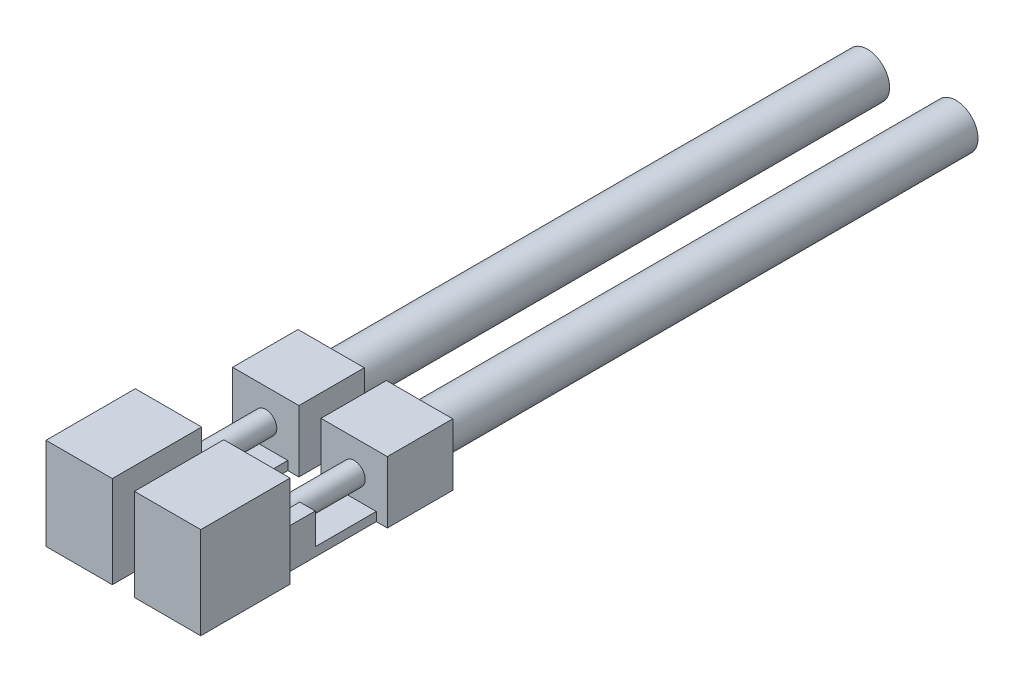
ISO-10303-21;
HEADER;
FILE_DESCRIPTION(('STEP AP214'),'2;1');
FILE_NAME('part.step','',(''),(''),'','','');
FILE_SCHEMA(('AUTOMOTIVE_DESIGN { 1 0 10303 214 1 1 1 1 }'));
ENDSEC;
DATA;
#1=APPLICATION_CONTEXT('core data for automotive mechanical design processes');
#2=APPLICATION_PROTOCOL_DEFINITION('international standard','automotive_design',2000,#1);
#3=PRODUCT_CONTEXT('',#1,'mechanical');
#4=PRODUCT('Part','Part','',(#3));
#5=PRODUCT_RELATED_PRODUCT_CATEGORY('part','',(#4));
#6=PRODUCT_DEFINITION_FORMATION('','',#4);
#7=PRODUCT_DEFINITION_CONTEXT('part definition',#1,'design');
#8=PRODUCT_DEFINITION('design','',#6,#7);
#9=PRODUCT_DEFINITION_SHAPE('','',#8);
#10=(LENGTH_UNIT() NAMED_UNIT(*) SI_UNIT(.MILLI.,.METRE.));
#11=(NAMED_UNIT(*) PLANE_ANGLE_UNIT() SI_UNIT($,.RADIAN.));
#12=(NAMED_UNIT(*) SI_UNIT($,.STERADIAN.) SOLID_ANGLE_UNIT());
#13=UNCERTAINTY_MEASURE_WITH_UNIT(LENGTH_MEASURE(1.E-05),#10,'distance_accuracy_value','');
#14=(GEOMETRIC_REPRESENTATION_CONTEXT(3) GLOBAL_UNCERTAINTY_ASSIGNED_CONTEXT((#13)) GLOBAL_UNIT_ASSIGNED_CONTEXT((#10,
#11,#12)) REPRESENTATION_CONTEXT('',''));
#15=CARTESIAN_POINT('',(0.,0.,0.));
#16=DIRECTION('',(0.,0.,1.));
#17=DIRECTION('',(1.,0.,0.));
#18=AXIS2_PLACEMENT_3D('',#15,#16,#17);
#19=CARTESIAN_POINT('',(-1.75,2.78,0.39));
#20=DIRECTION('',(0.,-1.,0.));
#21=DIRECTION('',(0.,0.,-1.));
#22=AXIS2_PLACEMENT_3D('',#19,#20,#21);
#23=PLANE('',#22);
#24=DIRECTION('',(0.,0.,-1.));
#25=VECTOR('',#24,1.);
#26=CARTESIAN_POINT('',(-1.4,2.78,0.39));
#27=LINE('',#26,#25);
#28=CARTESIAN_POINT('',(-1.4,2.78,-0.44));
#29=VERTEX_POINT('',#28);
#30=CARTESIAN_POINT('',(-1.4,2.78,0.385));
#31=VERTEX_POINT('',#30);
#32=EDGE_CURVE('E284',#29,#31,#27,.F.);
#33=ORIENTED_EDGE('',*,*,#32,.F.);
#34=DIRECTION('',(-1.,0.,0.));
#35=VECTOR('',#34,1.);
#36=CARTESIAN_POINT('',(-1.75,2.78,-0.44));
#37=LINE('',#36,#35);
#38=CARTESIAN_POINT('',(-1.75,2.78,-0.44));
#39=VERTEX_POINT('',#38);
#40=EDGE_CURVE('E266',#29,#39,#37,.T.);
#41=ORIENTED_EDGE('',*,*,#40,.T.);
#42=DIRECTION('',(0.,0.,-1.));
#43=VECTOR('',#42,1.);
#44=CARTESIAN_POINT('',(-1.75,2.78,0.39));
#45=LINE('',#44,#43);
#46=CARTESIAN_POINT('',(-1.75,2.78,0.38));
#47=VERTEX_POINT('',#46);
#48=EDGE_CURVE('E240',#47,#39,#45,.T.);
#49=ORIENTED_EDGE('',*,*,#48,.F.);
#50=DIRECTION('',(-1.,0.,0.));
#51=VECTOR('',#50,1.);
#52=CARTESIAN_POINT('',(0.,2.78,0.38));
#53=LINE('',#52,#51);
#54=EDGE_CURVE('E238',#31,#47,#53,.T.);
#55=ORIENTED_EDGE('',*,*,#54,.F.);
#56=EDGE_LOOP('',(#33,#41,#49,#55));
#57=FACE_BOUND('',#56,.T.);
#58=ADVANCED_FACE('F47',(#57),#23,.F.);
#59=DIRECTION('',(0.,0.,-1.));
#60=VECTOR('',#59,1.);
#61=CARTESIAN_POINT('',(-1.1,2.78,0.39));
#62=LINE('',#61,#60);
#63=CARTESIAN_POINT('',(-1.1,2.78,0.385));
#64=VERTEX_POINT('',#63);
#65=CARTESIAN_POINT('',(-1.1,2.78,-0.44));
#66=VERTEX_POINT('',#65);
#67=EDGE_CURVE('E66',#64,#66,#62,.T.);
#68=ORIENTED_EDGE('',*,*,#67,.F.);
#69=CARTESIAN_POINT('',(-0.75,2.78,0.38));
#70=VERTEX_POINT('',#69);
#71=EDGE_CURVE('E252',#70,#64,#53,.T.);
#72=ORIENTED_EDGE('',*,*,#71,.F.);
#73=DIRECTION('',(0.,0.,-1.));
#74=VECTOR('',#73,1.);
#75=CARTESIAN_POINT('',(-0.75,2.78,0.39));
#76=LINE('',#75,#74);
#77=CARTESIAN_POINT('',(-0.75,2.78,-0.44));
#78=VERTEX_POINT('',#77);
#79=EDGE_CURVE('E243',#70,#78,#76,.T.);
#80=ORIENTED_EDGE('',*,*,#79,.T.);
#81=EDGE_CURVE('E237',#78,#66,#37,.T.);
#82=ORIENTED_EDGE('',*,*,#81,.T.);
#83=EDGE_LOOP('',(#68,#72,#80,#82));
#84=FACE_BOUND('',#83,.T.);
#85=ADVANCED_FACE('F285',(#84),#23,.F.);
#86=CARTESIAN_POINT('',(0.,0.,-1.82));
#87=DIRECTION('',(0.,0.,-1.));
#88=DIRECTION('',(-1.,0.,0.));
#89=AXIS2_PLACEMENT_3D('',#86,#87,#88);
#90=PLANE('',#89);
#91=CARTESIAN_POINT('',(-1.25,2.58,-1.82));
#92=DIRECTION('',(0.,0.,-1.));
#93=DIRECTION('',(-1.,0.,0.));
#94=AXIS2_PLACEMENT_3D('',#91,#92,#93);
#95=CIRCLE('',#94,0.25);
#96=CARTESIAN_POINT('',(-1.5,2.58,-1.82));
#97=VERTEX_POINT('',#96);
#98=EDGE_CURVE('E12',#97,#97,#95,.F.);
#99=ORIENTED_EDGE('',*,*,#98,.F.);
#100=EDGE_LOOP('',(#99));
#101=FACE_BOUND('',#100,.T.);
#102=DIRECTION('',(0.,-1.,0.));
#103=VECTOR('',#102,1.);
#104=CARTESIAN_POINT('',(-1.75,0.,-1.82));
#105=LINE('',#104,#103);
#106=CARTESIAN_POINT('',(-1.75,2.08,-1.82));
#107=VERTEX_POINT('',#106);
#108=CARTESIAN_POINT('',(-1.75,1.88,-1.82));
#109=VERTEX_POINT('',#108);
#110=EDGE_CURVE('E210',#107,#109,#105,.T.);
#111=ORIENTED_EDGE('',*,*,#110,.F.);
#112=DIRECTION('',(-1.,0.,0.));
#113=VECTOR('',#112,1.);
#114=CARTESIAN_POINT('',(0.,2.08,-1.82));
#115=LINE('',#114,#113);
#116=CARTESIAN_POINT('',(-0.75,2.08,-1.82));
#117=VERTEX_POINT('',#116);
#118=EDGE_CURVE('E80',#117,#107,#115,.T.);
#119=ORIENTED_EDGE('',*,*,#118,.F.);
#120=DIRECTION('',(0.,1.,0.));
#121=VECTOR('',#120,1.);
#122=CARTESIAN_POINT('',(-0.75,0.,-1.82));
#123=LINE('',#122,#121);
#124=CARTESIAN_POINT('',(-0.75,1.88,-1.82));
#125=VERTEX_POINT('',#124);
#126=EDGE_CURVE('E207',#125,#117,#123,.T.);
#127=ORIENTED_EDGE('',*,*,#126,.F.);
#128=DIRECTION('',(-1.,0.,0.));
#129=VECTOR('',#128,1.);
#130=CARTESIAN_POINT('',(0.,1.88,-1.82));
#131=LINE('',#130,#129);
#132=CARTESIAN_POINT('',(-0.5,1.88,-1.82));
#133=VERTEX_POINT('',#132);
#134=EDGE_CURVE('E180',#125,#133,#131,.F.);
#135=ORIENTED_EDGE('',*,*,#134,.T.);
#136=DIRECTION('',(0.,1.,0.));
#137=VECTOR('',#136,1.);
#138=CARTESIAN_POINT('',(-0.5,1.88,-1.82));
#139=LINE('',#138,#137);
#140=CARTESIAN_POINT('',(-0.5,3.28,-1.82));
#141=VERTEX_POINT('',#140);
#142=EDGE_CURVE('E168',#133,#141,#139,.T.);
#143=ORIENTED_EDGE('',*,*,#142,.T.);
#144=DIRECTION('',(-1.,0.,0.));
#145=VECTOR('',#144,1.);
#146=CARTESIAN_POINT('',(-2.,3.28,-1.82));
#147=LINE('',#146,#145);
#148=CARTESIAN_POINT('',(-2.,3.28,-1.82));
#149=VERTEX_POINT('',#148);
#150=EDGE_CURVE('E172',#141,#149,#147,.T.);
#151=ORIENTED_EDGE('',*,*,#150,.T.);
#152=DIRECTION('',(0.,-1.,0.));
#153=VECTOR('',#152,1.);
#154=CARTESIAN_POINT('',(-2.,1.88,-1.82));
#155=LINE('',#154,#153);
#156=CARTESIAN_POINT('',(-2.,1.88,-1.82));
#157=VERTEX_POINT('',#156);
#158=EDGE_CURVE('E199',#149,#157,#155,.T.);
#159=ORIENTED_EDGE('',*,*,#158,.T.);
#160=DIRECTION('',(-1.,0.,0.));
#161=VECTOR('',#160,1.);
#162=CARTESIAN_POINT('',(0.,1.88,-1.82));
#163=LINE('',#162,#161);
#164=EDGE_CURVE('E201',#157,#109,#163,.F.);
#165=ORIENTED_EDGE('',*,*,#164,.T.);
#166=EDGE_LOOP('',(#111,#119,#127,#135,#143,#151,#159,#165));
#167=FACE_BOUND('',#166,.T.);
#168=ADVANCED_FACE('F51',(#101,#167),#90,.F.);
#169=CARTESIAN_POINT('',(-2.,1.88,-1.82));
#170=DIRECTION('',(1.,0.,0.));
#171=DIRECTION('',(0.,0.,-1.));
#172=AXIS2_PLACEMENT_3D('',#169,#170,#171);
#173=PLANE('',#172);
#174=DIRECTION('',(0.,-1.,0.));
#175=VECTOR('',#174,1.);
#176=CARTESIAN_POINT('',(-2.,1.88,-3.3));
#177=LINE('',#176,#175);
#178=CARTESIAN_POINT('',(-2.,3.28,-3.3));
#179=VERTEX_POINT('',#178);
#180=CARTESIAN_POINT('',(-2.,1.88,-3.3));
#181=VERTEX_POINT('',#180);
#182=EDGE_CURVE('E58',#179,#181,#177,.T.);
#183=ORIENTED_EDGE('',*,*,#182,.T.);
#184=DIRECTION('',(0.,0.,-1.));
#185=VECTOR('',#184,1.);
#186=CARTESIAN_POINT('',(-2.,1.88,-1.82));
#187=LINE('',#186,#185);
#188=EDGE_CURVE('E204',#157,#181,#187,.T.);
#189=ORIENTED_EDGE('',*,*,#188,.F.);
#190=ORIENTED_EDGE('',*,*,#158,.F.);
#191=DIRECTION('',(0.,0.,-1.));
#192=VECTOR('',#191,1.);
#193=CARTESIAN_POINT('',(-2.,3.28,-1.82));
#194=LINE('',#193,#192);
#195=EDGE_CURVE('E187',#149,#179,#194,.T.);
#196=ORIENTED_EDGE('',*,*,#195,.T.);
#197=EDGE_LOOP('',(#183,#189,#190,#196));
#198=FACE_BOUND('',#197,.T.);
#199=ADVANCED_FACE('F351',(#198),#173,.F.);
#200=CARTESIAN_POINT('',(-2.,1.88,-1.82));
#201=DIRECTION('',(0.,1.,0.));
#202=DIRECTION('',(0.,0.,1.));
#203=AXIS2_PLACEMENT_3D('',#200,#201,#202);
#204=PLANE('',#203);
#205=DIRECTION('',(1.,0.,0.));
#206=VECTOR('',#205,1.);
#207=CARTESIAN_POINT('',(-2.,1.88,-3.3));
#208=LINE('',#207,#206);
#209=CARTESIAN_POINT('',(-0.5,1.88,-3.3));
#210=VERTEX_POINT('',#209);
#211=EDGE_CURVE('E371',#181,#210,#208,.T.);
#212=ORIENTED_EDGE('',*,*,#211,.T.);
#213=DIRECTION('',(0.,0.,-1.));
#214=VECTOR('',#213,1.);
#215=CARTESIAN_POINT('',(-0.5,1.88,-1.82));
#216=LINE('',#215,#214);
#217=EDGE_CURVE('E189',#133,#210,#216,.T.);
#218=ORIENTED_EDGE('',*,*,#217,.F.);
#219=ORIENTED_EDGE('',*,*,#134,.F.);
#220=DIRECTION('',(0.,0.,-1.));
#221=VECTOR('',#220,1.);
#222=CARTESIAN_POINT('',(-0.75,1.88,-0.43));
#223=LINE('',#222,#221);
#224=CARTESIAN_POINT('',(-0.75,1.88,0.38));
#225=VERTEX_POINT('',#224);
#226=EDGE_CURVE('E223',#225,#125,#223,.T.);
#227=ORIENTED_EDGE('',*,*,#226,.F.);
#228=DIRECTION('',(1.,0.,0.));
#229=VECTOR('',#228,1.);
#230=CARTESIAN_POINT('',(-2.,1.88,0.38));
#231=LINE('',#230,#229);
#232=CARTESIAN_POINT('',(-0.5,1.88,0.38));
#233=VERTEX_POINT('',#232);
#234=EDGE_CURVE('E126',#225,#233,#231,.T.);
#235=ORIENTED_EDGE('',*,*,#234,.T.);
#236=DIRECTION('',(0.,0.,-1.));
#237=VECTOR('',#236,1.);
#238=CARTESIAN_POINT('',(-0.5,1.88,2.4));
#239=LINE('',#238,#237);
#240=CARTESIAN_POINT('',(-0.5,1.88,2.4));
#241=VERTEX_POINT('',#240);
#242=EDGE_CURVE('E378',#241,#233,#239,.T.);
#243=ORIENTED_EDGE('',*,*,#242,.F.);
#244=DIRECTION('',(1.,0.,0.));
#245=VECTOR('',#244,1.);
#246=CARTESIAN_POINT('',(-2.,1.88,2.4));
#247=LINE('',#246,#245);
#248=CARTESIAN_POINT('',(-2.,1.88,2.4));
#249=VERTEX_POINT('',#248);
#250=EDGE_CURVE('E389',#249,#241,#247,.T.);
#251=ORIENTED_EDGE('',*,*,#250,.F.);
#252=DIRECTION('',(0.,0.,-1.));
#253=VECTOR('',#252,1.);
#254=CARTESIAN_POINT('',(-2.,1.88,2.4));
#255=LINE('',#254,#253);
#256=CARTESIAN_POINT('',(-2.,1.88,0.38));
#257=VERTEX_POINT('',#256);
#258=EDGE_CURVE('E259',#249,#257,#255,.T.);
#259=ORIENTED_EDGE('',*,*,#258,.T.);
#260=DIRECTION('',(1.,0.,0.));
#261=VECTOR('',#260,1.);
#262=CARTESIAN_POINT('',(-2.,1.88,0.38));
#263=LINE('',#262,#261);
#264=CARTESIAN_POINT('',(-1.75,1.88,0.38));
#265=VERTEX_POINT('',#264);
#266=EDGE_CURVE('E265',#257,#265,#263,.T.);
#267=ORIENTED_EDGE('',*,*,#266,.T.);
#268=DIRECTION('',(0.,0.,-1.));
#269=VECTOR('',#268,1.);
#270=CARTESIAN_POINT('',(-1.75,1.88,-0.43));
#271=LINE('',#270,#269);
#272=EDGE_CURVE('E225',#265,#109,#271,.T.);
#273=ORIENTED_EDGE('',*,*,#272,.T.);
#274=ORIENTED_EDGE('',*,*,#164,.F.);
#275=ORIENTED_EDGE('',*,*,#188,.T.);
#276=EDGE_LOOP('',(#212,#218,#219,#227,#235,#243,#251,#259,#267,#273,#274,#275));
#277=FACE_BOUND('',#276,.T.);
#278=ADVANCED_FACE('F358',(#277),#204,.F.);
#279=CARTESIAN_POINT('',(-0.5,1.88,-1.82));
#280=DIRECTION('',(-1.,0.,0.));
#281=DIRECTION('',(0.,0.,1.));
#282=AXIS2_PLACEMENT_3D('',#279,#280,#281);
#283=PLANE('',#282);
#284=DIRECTION('',(0.,1.,0.));
#285=VECTOR('',#284,1.);
#286=CARTESIAN_POINT('',(-0.5,1.88,-3.3));
#287=LINE('',#286,#285);
#288=CARTESIAN_POINT('',(-0.5,3.28,-3.3));
#289=VERTEX_POINT('',#288);
#290=EDGE_CURVE('E188',#210,#289,#287,.T.);
#291=ORIENTED_EDGE('',*,*,#290,.T.);
#292=DIRECTION('',(0.,0.,-1.));
#293=VECTOR('',#292,1.);
#294=CARTESIAN_POINT('',(-0.5,3.28,-1.82));
#295=LINE('',#294,#293);
#296=EDGE_CURVE('E181',#141,#289,#295,.T.);
#297=ORIENTED_EDGE('',*,*,#296,.F.);
#298=ORIENTED_EDGE('',*,*,#142,.F.);
#299=ORIENTED_EDGE('',*,*,#217,.T.);
#300=EDGE_LOOP('',(#291,#297,#298,#299));
#301=FACE_BOUND('',#300,.T.);
#302=ADVANCED_FACE('F184',(#301),#283,.F.);
#303=CARTESIAN_POINT('',(-2.,3.28,-1.82));
#304=DIRECTION('',(0.,-1.,0.));
#305=DIRECTION('',(0.,0.,-1.));
#306=AXIS2_PLACEMENT_3D('',#303,#304,#305);
#307=PLANE('',#306);
#308=DIRECTION('',(-1.,0.,0.));
#309=VECTOR('',#308,1.);
#310=CARTESIAN_POINT('',(-2.,3.28,-3.3));
#311=LINE('',#310,#309);
#312=EDGE_CURVE('E205',#289,#179,#311,.T.);
#313=ORIENTED_EDGE('',*,*,#312,.T.);
#314=ORIENTED_EDGE('',*,*,#195,.F.);
#315=ORIENTED_EDGE('',*,*,#150,.F.);
#316=ORIENTED_EDGE('',*,*,#296,.T.);
#317=EDGE_LOOP('',(#313,#314,#315,#316));
#318=FACE_BOUND('',#317,.T.);
#319=ADVANCED_FACE('F195',(#318),#307,.F.);
#320=CARTESIAN_POINT('',(0.,0.,-3.3));
#321=DIRECTION('',(0.,0.,-1.));
#322=DIRECTION('',(-1.,0.,0.));
#323=AXIS2_PLACEMENT_3D('',#320,#321,#322);
#324=PLANE('',#323);
#325=CARTESIAN_POINT('',(-1.25,2.58,-3.3));
#326=DIRECTION('',(0.,0.,-1.));
#327=DIRECTION('',(-1.,0.,0.));
#328=AXIS2_PLACEMENT_3D('',#325,#326,#327);
#329=CIRCLE('',#328,0.5);
#330=CARTESIAN_POINT('',(-1.75,2.58,-3.3));
#331=VERTEX_POINT('',#330);
#332=EDGE_CURVE('E258',#331,#331,#329,.F.);
#333=ORIENTED_EDGE('',*,*,#332,.T.);
#334=EDGE_LOOP('',(#333));
#335=FACE_BOUND('',#334,.T.);
#336=ORIENTED_EDGE('',*,*,#182,.F.);
#337=ORIENTED_EDGE('',*,*,#312,.F.);
#338=ORIENTED_EDGE('',*,*,#290,.F.);
#339=ORIENTED_EDGE('',*,*,#211,.F.);
#340=EDGE_LOOP('',(#336,#337,#338,#339));
#341=FACE_BOUND('',#340,.T.);
#342=ADVANCED_FACE('F350',(#335,#341),#324,.T.);
#343=CARTESIAN_POINT('',(-1.75,1.88,-0.43));
#344=DIRECTION('',(1.,0.,0.));
#345=DIRECTION('',(0.,0.,-1.));
#346=AXIS2_PLACEMENT_3D('',#343,#344,#345);
#347=PLANE('',#346);
#348=ORIENTED_EDGE('',*,*,#110,.T.);
#349=ORIENTED_EDGE('',*,*,#272,.F.);
#350=DIRECTION('',(0.,1.,0.));
#351=VECTOR('',#350,1.);
#352=CARTESIAN_POINT('',(-1.75,0.,0.38));
#353=LINE('',#352,#351);
#354=EDGE_CURVE('E262',#47,#265,#353,.F.);
#355=ORIENTED_EDGE('',*,*,#354,.F.);
#356=ORIENTED_EDGE('',*,*,#48,.T.);
#357=DIRECTION('',(0.,1.,0.));
#358=VECTOR('',#357,1.);
#359=CARTESIAN_POINT('',(-1.75,1.88,-0.44));
#360=LINE('',#359,#358);
#361=CARTESIAN_POINT('',(-1.75,2.08,-0.44));
#362=VERTEX_POINT('',#361);
#363=EDGE_CURVE('E228',#39,#362,#360,.F.);
#364=ORIENTED_EDGE('',*,*,#363,.T.);
#365=DIRECTION('',(0.,0.,-1.));
#366=VECTOR('',#365,1.);
#367=CARTESIAN_POINT('',(-1.75,2.08,-0.43));
#368=LINE('',#367,#366);
#369=EDGE_CURVE('E217',#362,#107,#368,.T.);
#370=ORIENTED_EDGE('',*,*,#369,.T.);
#371=EDGE_LOOP('',(#348,#349,#355,#356,#364,#370));
#372=FACE_BOUND('',#371,.T.);
#373=ADVANCED_FACE('F344',(#372),#347,.F.);
#374=CARTESIAN_POINT('',(-0.75,1.88,-0.43));
#375=DIRECTION('',(-1.,0.,0.));
#376=DIRECTION('',(0.,0.,1.));
#377=AXIS2_PLACEMENT_3D('',#374,#375,#376);
#378=PLANE('',#377);
#379=ORIENTED_EDGE('',*,*,#126,.T.);
#380=DIRECTION('',(0.,0.,-1.));
#381=VECTOR('',#380,1.);
#382=CARTESIAN_POINT('',(-0.75,2.08,-0.43));
#383=LINE('',#382,#381);
#384=CARTESIAN_POINT('',(-0.75,2.08,-0.44));
#385=VERTEX_POINT('',#384);
#386=EDGE_CURVE('E222',#385,#117,#383,.T.);
#387=ORIENTED_EDGE('',*,*,#386,.F.);
#388=DIRECTION('',(0.,1.,0.));
#389=VECTOR('',#388,1.);
#390=CARTESIAN_POINT('',(-0.75,1.88,-0.44));
#391=LINE('',#390,#389);
#392=EDGE_CURVE('E234',#385,#78,#391,.T.);
#393=ORIENTED_EDGE('',*,*,#392,.T.);
#394=ORIENTED_EDGE('',*,*,#79,.F.);
#395=DIRECTION('',(0.,1.,0.));
#396=VECTOR('',#395,1.);
#397=CARTESIAN_POINT('',(-0.75,0.,0.38));
#398=LINE('',#397,#396);
#399=EDGE_CURVE('E250',#225,#70,#398,.T.);
#400=ORIENTED_EDGE('',*,*,#399,.F.);
#401=ORIENTED_EDGE('',*,*,#226,.T.);
#402=EDGE_LOOP('',(#379,#387,#393,#394,#400,#401));
#403=FACE_BOUND('',#402,.T.);
#404=ADVANCED_FACE('F280',(#403),#378,.F.);
#405=CARTESIAN_POINT('',(-1.75,2.08,-0.43));
#406=DIRECTION('',(0.,-1.,0.));
#407=DIRECTION('',(0.,0.,-1.));
#408=AXIS2_PLACEMENT_3D('',#405,#406,#407);
#409=PLANE('',#408);
#410=ORIENTED_EDGE('',*,*,#118,.T.);
#411=ORIENTED_EDGE('',*,*,#369,.F.);
#412=DIRECTION('',(-1.,0.,0.));
#413=VECTOR('',#412,1.);
#414=CARTESIAN_POINT('',(0.,2.08,-0.44));
#415=LINE('',#414,#413);
#416=EDGE_CURVE('E213',#385,#362,#415,.T.);
#417=ORIENTED_EDGE('',*,*,#416,.F.);
#418=ORIENTED_EDGE('',*,*,#386,.T.);
#419=EDGE_LOOP('',(#410,#411,#417,#418));
#420=FACE_BOUND('',#419,.T.);
#421=ADVANCED_FACE('F345',(#420),#409,.F.);
#422=CARTESIAN_POINT('',(0.,0.,-0.44));
#423=DIRECTION('',(0.,0.,-1.));
#424=DIRECTION('',(-1.,0.,0.));
#425=AXIS2_PLACEMENT_3D('',#422,#423,#424);
#426=PLANE('',#425);
#427=ORIENTED_EDGE('',*,*,#40,.F.);
#428=CARTESIAN_POINT('',(-1.25,2.58,-0.44));
#429=DIRECTION('',(0.,0.,-1.));
#430=DIRECTION('',(-1.,0.,0.));
#431=AXIS2_PLACEMENT_3D('',#428,#429,#430);
#432=CIRCLE('',#431,0.25);
#433=EDGE_CURVE('E286',#29,#66,#432,.F.);
#434=ORIENTED_EDGE('',*,*,#433,.T.);
#435=ORIENTED_EDGE('',*,*,#81,.F.);
#436=ORIENTED_EDGE('',*,*,#392,.F.);
#437=ORIENTED_EDGE('',*,*,#416,.T.);
#438=ORIENTED_EDGE('',*,*,#363,.F.);
#439=EDGE_LOOP('',(#427,#434,#435,#436,#437,#438));
#440=FACE_BOUND('',#439,.T.);
#441=ADVANCED_FACE('F323',(#440),#426,.T.);
#442=CARTESIAN_POINT('',(-2.,1.88,2.4));
#443=DIRECTION('',(1.,0.,0.));
#444=DIRECTION('',(0.,0.,-1.));
#445=AXIS2_PLACEMENT_3D('',#442,#443,#444);
#446=PLANE('',#445);
#447=DIRECTION('',(0.,-1.,0.));
#448=VECTOR('',#447,1.);
#449=CARTESIAN_POINT('',(-2.,1.88,0.38));
#450=LINE('',#449,#448);
#451=CARTESIAN_POINT('',(-2.,3.96,0.38));
#452=VERTEX_POINT('',#451);
#453=EDGE_CURVE('E242',#452,#257,#450,.T.);
#454=ORIENTED_EDGE('',*,*,#453,.T.);
#455=ORIENTED_EDGE('',*,*,#258,.F.);
#456=DIRECTION('',(0.,-1.,0.));
#457=VECTOR('',#456,1.);
#458=CARTESIAN_POINT('',(-2.,1.88,2.4));
#459=LINE('',#458,#457);
#460=CARTESIAN_POINT('',(-2.,3.96,2.4));
#461=VERTEX_POINT('',#460);
#462=EDGE_CURVE('E384',#461,#249,#459,.T.);
#463=ORIENTED_EDGE('',*,*,#462,.F.);
#464=DIRECTION('',(0.,0.,-1.));
#465=VECTOR('',#464,1.);
#466=CARTESIAN_POINT('',(-2.,3.96,2.4));
#467=LINE('',#466,#465);
#468=EDGE_CURVE('E392',#461,#452,#467,.T.);
#469=ORIENTED_EDGE('',*,*,#468,.T.);
#470=EDGE_LOOP('',(#454,#455,#463,#469));
#471=FACE_BOUND('',#470,.T.);
#472=ADVANCED_FACE('F317',(#471),#446,.F.);
#473=CARTESIAN_POINT('',(-0.5,1.88,2.4));
#474=DIRECTION('',(-1.,0.,0.));
#475=DIRECTION('',(0.,0.,1.));
#476=AXIS2_PLACEMENT_3D('',#473,#474,#475);
#477=PLANE('',#476);
#478=DIRECTION('',(0.,1.,0.));
#479=VECTOR('',#478,1.);
#480=CARTESIAN_POINT('',(-0.5,1.88,0.38));
#481=LINE('',#480,#479);
#482=CARTESIAN_POINT('',(-0.5,3.96,0.38));
#483=VERTEX_POINT('',#482);
#484=EDGE_CURVE('E138',#233,#483,#481,.T.);
#485=ORIENTED_EDGE('',*,*,#484,.T.);
#486=DIRECTION('',(0.,0.,-1.));
#487=VECTOR('',#486,1.);
#488=CARTESIAN_POINT('',(-0.5,3.96,2.4));
#489=LINE('',#488,#487);
#490=CARTESIAN_POINT('',(-0.5,3.96,2.4));
#491=VERTEX_POINT('',#490);
#492=EDGE_CURVE('E379',#491,#483,#489,.T.);
#493=ORIENTED_EDGE('',*,*,#492,.F.);
#494=DIRECTION('',(0.,1.,0.));
#495=VECTOR('',#494,1.);
#496=CARTESIAN_POINT('',(-0.5,1.88,2.4));
#497=LINE('',#496,#495);
#498=EDGE_CURVE('E388',#241,#491,#497,.T.);
#499=ORIENTED_EDGE('',*,*,#498,.F.);
#500=ORIENTED_EDGE('',*,*,#242,.T.);
#501=EDGE_LOOP('',(#485,#493,#499,#500));
#502=FACE_BOUND('',#501,.T.);
#503=ADVANCED_FACE('F325',(#502),#477,.F.);
#504=CARTESIAN_POINT('',(-2.,3.96,2.4));
#505=DIRECTION('',(0.,-1.,0.));
#506=DIRECTION('',(0.,0.,-1.));
#507=AXIS2_PLACEMENT_3D('',#504,#505,#506);
#508=PLANE('',#507);
#509=DIRECTION('',(-1.,0.,0.));
#510=VECTOR('',#509,1.);
#511=CARTESIAN_POINT('',(-2.,3.96,0.38));
#512=LINE('',#511,#510);
#513=EDGE_CURVE('E380',#483,#452,#512,.T.);
#514=ORIENTED_EDGE('',*,*,#513,.T.);
#515=ORIENTED_EDGE('',*,*,#468,.F.);
#516=DIRECTION('',(-1.,0.,0.));
#517=VECTOR('',#516,1.);
#518=CARTESIAN_POINT('',(-2.,3.96,2.4));
#519=LINE('',#518,#517);
#520=EDGE_CURVE('E395',#491,#461,#519,.T.);
#521=ORIENTED_EDGE('',*,*,#520,.F.);
#522=ORIENTED_EDGE('',*,*,#492,.T.);
#523=EDGE_LOOP('',(#514,#515,#521,#522));
#524=FACE_BOUND('',#523,.T.);
#525=ADVANCED_FACE('F330',(#524),#508,.F.);
#526=CARTESIAN_POINT('',(0.,0.,2.4));
#527=DIRECTION('',(0.,0.,-1.));
#528=DIRECTION('',(-1.,0.,0.));
#529=AXIS2_PLACEMENT_3D('',#526,#527,#528);
#530=PLANE('',#529);
#531=ORIENTED_EDGE('',*,*,#462,.T.);
#532=ORIENTED_EDGE('',*,*,#250,.T.);
#533=ORIENTED_EDGE('',*,*,#498,.T.);
#534=ORIENTED_EDGE('',*,*,#520,.T.);
#535=EDGE_LOOP('',(#531,#532,#533,#534));
#536=FACE_BOUND('',#535,.T.);
#537=ADVANCED_FACE('F328',(#536),#530,.F.);
#538=CARTESIAN_POINT('',(0.,0.,0.38));
#539=DIRECTION('',(0.,0.,-1.));
#540=DIRECTION('',(-1.,0.,0.));
#541=AXIS2_PLACEMENT_3D('',#538,#539,#540);
#542=PLANE('',#541);
#543=ORIENTED_EDGE('',*,*,#71,.T.);
#544=CARTESIAN_POINT('',(-1.1,2.78,0.38));
#545=CARTESIAN_POINT('',(-1.25,2.8925,0.38));
#546=CARTESIAN_POINT('',(-1.4,2.78,0.38));
#547=B_SPLINE_CURVE_WITH_KNOTS('',2,(#544,#545,#546),.UNSPECIFIED.,.F.,.F.,(3,3),(0.,1.),.UNSPECIFIED.);
#548=EDGE_CURVE('E254',#64,#31,#547,.T.);
#549=ORIENTED_EDGE('',*,*,#548,.T.);
#550=ORIENTED_EDGE('',*,*,#54,.T.);
#551=ORIENTED_EDGE('',*,*,#354,.T.);
#552=ORIENTED_EDGE('',*,*,#266,.F.);
#553=ORIENTED_EDGE('',*,*,#453,.F.);
#554=ORIENTED_EDGE('',*,*,#513,.F.);
#555=ORIENTED_EDGE('',*,*,#484,.F.);
#556=ORIENTED_EDGE('',*,*,#234,.F.);
#557=ORIENTED_EDGE('',*,*,#399,.T.);
#558=EDGE_LOOP('',(#543,#549,#550,#551,#552,#553,#554,#555,#556,#557));
#559=FACE_BOUND('',#558,.T.);
#560=ADVANCED_FACE('F275',(#559),#542,.T.);
#561=CARTESIAN_POINT('',(-1.25,2.58,-1.82));
#562=DIRECTION('',(0.,0.,-1.));
#563=DIRECTION('',(-1.,0.,0.));
#564=AXIS2_PLACEMENT_3D('',#561,#562,#563);
#565=CYLINDRICAL_SURFACE('',#564,0.5);
#566=ORIENTED_EDGE('',*,*,#332,.F.);
#567=EDGE_LOOP('',(#566));
#568=FACE_BOUND('',#567,.T.);
#569=CARTESIAN_POINT('',(-1.25,2.58,-15.43));
#570=DIRECTION('',(0.,0.,1.));
#571=DIRECTION('',(1.,0.,0.));
#572=AXIS2_PLACEMENT_3D('',#569,#570,#571);
#573=CIRCLE('',#572,0.5);
#574=CARTESIAN_POINT('',(-0.75,2.58,-15.43));
#575=VERTEX_POINT('',#574);
#576=EDGE_CURVE('E257',#575,#575,#573,.T.);
#577=ORIENTED_EDGE('',*,*,#576,.T.);
#578=EDGE_LOOP('',(#577));
#579=FACE_BOUND('',#578,.T.);
#580=ADVANCED_FACE('F315',(#568,#579),#565,.T.);
#581=CARTESIAN_POINT('',(-1.25,2.58,-15.43));
#582=DIRECTION('',(0.,0.,1.));
#583=DIRECTION('',(1.,0.,0.));
#584=AXIS2_PLACEMENT_3D('',#581,#582,#583);
#585=PLANE('',#584);
#586=ORIENTED_EDGE('',*,*,#576,.F.);
#587=EDGE_LOOP('',(#586));
#588=FACE_BOUND('',#587,.T.);
#589=ADVANCED_FACE('F313',(#588),#585,.F.);
#590=CARTESIAN_POINT('',(-1.25,2.58,0.39));
#591=DIRECTION('',(0.,0.,-1.));
#592=DIRECTION('',(-1.,0.,0.));
#593=AXIS2_PLACEMENT_3D('',#590,#591,#592);
#594=CYLINDRICAL_SURFACE('',#593,0.25);
#595=ORIENTED_EDGE('',*,*,#433,.F.);
#596=ORIENTED_EDGE('',*,*,#32,.T.);
#597=ORIENTED_EDGE('',*,*,#548,.F.);
#598=ORIENTED_EDGE('',*,*,#67,.T.);
#599=EDGE_LOOP('',(#595,#596,#597,#598));
#600=FACE_BOUND('',#599,.T.);
#601=ORIENTED_EDGE('',*,*,#98,.T.);
#602=EDGE_LOOP('',(#601));
#603=FACE_BOUND('',#602,.T.);
#604=ADVANCED_FACE('F305',(#600,#603),#594,.T.);
#605=CLOSED_SHELL('',(#58,#85,#168,#199,#278,#302,#319,#342,#373,#404,#421,#441,#472,#503,#525,
#537,#560,#580,#589,#604));
#606=MANIFOLD_SOLID_BREP('B2',#605);
#607=CARTESIAN_POINT('',(-3.75,2.78,0.39));
#608=DIRECTION('',(0.,-1.,0.));
#609=DIRECTION('',(0.,0.,-1.));
#610=AXIS2_PLACEMENT_3D('',#607,#608,#609);
#611=PLANE('',#610);
#612=DIRECTION('',(0.,0.,-1.));
#613=VECTOR('',#612,1.);
#614=CARTESIAN_POINT('',(-3.4,2.78,0.39));
#615=LINE('',#614,#613);
#616=CARTESIAN_POINT('',(-3.4,2.78,-0.44));
#617=VERTEX_POINT('',#616);
#618=CARTESIAN_POINT('',(-3.4,2.78,0.385));
#619=VERTEX_POINT('',#618);
#620=EDGE_CURVE('E913',#617,#619,#615,.F.);
#621=ORIENTED_EDGE('',*,*,#620,.F.);
#622=DIRECTION('',(-1.,0.,0.));
#623=VECTOR('',#622,1.);
#624=CARTESIAN_POINT('',(-3.75,2.78,-0.44));
#625=LINE('',#624,#623);
#626=CARTESIAN_POINT('',(-3.75,2.78,-0.44));
#627=VERTEX_POINT('',#626);
#628=EDGE_CURVE('E739',#617,#627,#625,.T.);
#629=ORIENTED_EDGE('',*,*,#628,.T.);
#630=DIRECTION('',(0.,0.,-1.));
#631=VECTOR('',#630,1.);
#632=CARTESIAN_POINT('',(-3.75,2.78,0.39));
#633=LINE('',#632,#631);
#634=CARTESIAN_POINT('',(-3.75,2.78,0.38));
#635=VERTEX_POINT('',#634);
#636=EDGE_CURVE('E742',#635,#627,#633,.T.);
#637=ORIENTED_EDGE('',*,*,#636,.F.);
#638=DIRECTION('',(-1.,0.,0.));
#639=VECTOR('',#638,1.);
#640=CARTESIAN_POINT('',(0.,2.78,0.38));
#641=LINE('',#640,#639);
#642=EDGE_CURVE('E760',#619,#635,#641,.T.);
#643=ORIENTED_EDGE('',*,*,#642,.F.);
#644=EDGE_LOOP('',(#621,#629,#637,#643));
#645=FACE_BOUND('',#644,.T.);
#646=ADVANCED_FACE('F559',(#645),#611,.F.);
#647=DIRECTION('',(0.,0.,-1.));
#648=VECTOR('',#647,1.);
#649=CARTESIAN_POINT('',(-3.1,2.78,0.39));
#650=LINE('',#649,#648);
#651=CARTESIAN_POINT('',(-3.1,2.78,0.385));
#652=VERTEX_POINT('',#651);
#653=CARTESIAN_POINT('',(-3.1,2.78,-0.44));
#654=VERTEX_POINT('',#653);
#655=EDGE_CURVE('E579',#652,#654,#650,.T.);
#656=ORIENTED_EDGE('',*,*,#655,.F.);
#657=CARTESIAN_POINT('',(-2.75,2.78,0.38));
#658=VERTEX_POINT('',#657);
#659=EDGE_CURVE('E746',#658,#652,#641,.T.);
#660=ORIENTED_EDGE('',*,*,#659,.F.);
#661=DIRECTION('',(0.,0.,-1.));
#662=VECTOR('',#661,1.);
#663=CARTESIAN_POINT('',(-2.75,2.78,0.39));
#664=LINE('',#663,#662);
#665=CARTESIAN_POINT('',(-2.75,2.78,-0.44));
#666=VERTEX_POINT('',#665);
#667=EDGE_CURVE('E728',#658,#666,#664,.T.);
#668=ORIENTED_EDGE('',*,*,#667,.T.);
#669=EDGE_CURVE('E775',#666,#654,#625,.T.);
#670=ORIENTED_EDGE('',*,*,#669,.T.);
#671=EDGE_LOOP('',(#656,#660,#668,#670));
#672=FACE_BOUND('',#671,.T.);
#673=ADVANCED_FACE('F852',(#672),#611,.F.);
#674=CARTESIAN_POINT('',(0.,0.,-1.82));
#675=DIRECTION('',(0.,0.,-1.));
#676=DIRECTION('',(-1.,0.,0.));
#677=AXIS2_PLACEMENT_3D('',#674,#675,#676);
#678=PLANE('',#677);
#679=CARTESIAN_POINT('',(-3.25,2.58,-1.82));
#680=DIRECTION('',(0.,0.,-1.));
#681=DIRECTION('',(-1.,0.,0.));
#682=AXIS2_PLACEMENT_3D('',#679,#680,#681);
#683=CIRCLE('',#682,0.25);
#684=CARTESIAN_POINT('',(-3.5,2.58,-1.82));
#685=VERTEX_POINT('',#684);
#686=EDGE_CURVE('E50',#685,#685,#683,.F.);
#687=ORIENTED_EDGE('',*,*,#686,.F.);
#688=EDGE_LOOP('',(#687));
#689=FACE_BOUND('',#688,.T.);
#690=DIRECTION('',(0.,-1.,0.));
#691=VECTOR('',#690,1.);
#692=CARTESIAN_POINT('',(-3.75,0.,-1.82));
#693=LINE('',#692,#691);
#694=CARTESIAN_POINT('',(-3.75,2.08,-1.82));
#695=VERTEX_POINT('',#694);
#696=CARTESIAN_POINT('',(-3.75,1.88,-1.82));
#697=VERTEX_POINT('',#696);
#698=EDGE_CURVE('E723',#695,#697,#693,.T.);
#699=ORIENTED_EDGE('',*,*,#698,.F.);
#700=DIRECTION('',(-1.,0.,0.));
#701=VECTOR('',#700,1.);
#702=CARTESIAN_POINT('',(0.,2.08,-1.82));
#703=LINE('',#702,#701);
#704=CARTESIAN_POINT('',(-2.75,2.08,-1.82));
#705=VERTEX_POINT('',#704);
#706=EDGE_CURVE('E586',#705,#695,#703,.T.);
#707=ORIENTED_EDGE('',*,*,#706,.F.);
#708=DIRECTION('',(0.,1.,0.));
#709=VECTOR('',#708,1.);
#710=CARTESIAN_POINT('',(-2.75,0.,-1.82));
#711=LINE('',#710,#709);
#712=CARTESIAN_POINT('',(-2.75,1.88,-1.82));
#713=VERTEX_POINT('',#712);
#714=EDGE_CURVE('E719',#713,#705,#711,.T.);
#715=ORIENTED_EDGE('',*,*,#714,.F.);
#716=DIRECTION('',(-1.,0.,0.));
#717=VECTOR('',#716,1.);
#718=CARTESIAN_POINT('',(0.,1.88,-1.82));
#719=LINE('',#718,#717);
#720=CARTESIAN_POINT('',(-2.5,1.88,-1.82));
#721=VERTEX_POINT('',#720);
#722=EDGE_CURVE('E711',#713,#721,#719,.F.);
#723=ORIENTED_EDGE('',*,*,#722,.T.);
#724=DIRECTION('',(0.,1.,0.));
#725=VECTOR('',#724,1.);
#726=CARTESIAN_POINT('',(-2.5,1.88,-1.82));
#727=LINE('',#726,#725);
#728=CARTESIAN_POINT('',(-2.5,3.28,-1.82));
#729=VERTEX_POINT('',#728);
#730=EDGE_CURVE('E714',#721,#729,#727,.T.);
#731=ORIENTED_EDGE('',*,*,#730,.T.);
#732=DIRECTION('',(-1.,0.,0.));
#733=VECTOR('',#732,1.);
#734=CARTESIAN_POINT('',(-4.,3.28,-1.82));
#735=LINE('',#734,#733);
#736=CARTESIAN_POINT('',(-4.,3.28,-1.82));
#737=VERTEX_POINT('',#736);
#738=EDGE_CURVE('E691',#729,#737,#735,.T.);
#739=ORIENTED_EDGE('',*,*,#738,.T.);
#740=DIRECTION('',(0.,-1.,0.));
#741=VECTOR('',#740,1.);
#742=CARTESIAN_POINT('',(-4.,1.88,-1.82));
#743=LINE('',#742,#741);
#744=CARTESIAN_POINT('',(-4.,1.88,-1.82));
#745=VERTEX_POINT('',#744);
#746=EDGE_CURVE('E684',#737,#745,#743,.T.);
#747=ORIENTED_EDGE('',*,*,#746,.T.);
#748=DIRECTION('',(-1.,0.,0.));
#749=VECTOR('',#748,1.);
#750=CARTESIAN_POINT('',(0.,1.88,-1.82));
#751=LINE('',#750,#749);
#752=EDGE_CURVE('E720',#745,#697,#751,.F.);
#753=ORIENTED_EDGE('',*,*,#752,.T.);
#754=EDGE_LOOP('',(#699,#707,#715,#723,#731,#739,#747,#753));
#755=FACE_BOUND('',#754,.T.);
#756=ADVANCED_FACE('F870',(#689,#755),#678,.F.);
#757=CARTESIAN_POINT('',(-4.,1.88,-1.82));
#758=DIRECTION('',(1.,0.,0.));
#759=DIRECTION('',(0.,0.,-1.));
#760=AXIS2_PLACEMENT_3D('',#757,#758,#759);
#761=PLANE('',#760);
#762=DIRECTION('',(0.,-1.,0.));
#763=VECTOR('',#762,1.);
#764=CARTESIAN_POINT('',(-4.,1.88,-3.3));
#765=LINE('',#764,#763);
#766=CARTESIAN_POINT('',(-4.,3.28,-3.3));
#767=VERTEX_POINT('',#766);
#768=CARTESIAN_POINT('',(-4.,1.88,-3.3));
#769=VERTEX_POINT('',#768);
#770=EDGE_CURVE('E693',#767,#769,#765,.T.);
#771=ORIENTED_EDGE('',*,*,#770,.T.);
#772=DIRECTION('',(0.,0.,-1.));
#773=VECTOR('',#772,1.);
#774=CARTESIAN_POINT('',(-4.,1.88,-1.82));
#775=LINE('',#774,#773);
#776=EDGE_CURVE('E573',#745,#769,#775,.T.);
#777=ORIENTED_EDGE('',*,*,#776,.F.);
#778=ORIENTED_EDGE('',*,*,#746,.F.);
#779=DIRECTION('',(0.,0.,-1.));
#780=VECTOR('',#779,1.);
#781=CARTESIAN_POINT('',(-4.,3.28,-1.82));
#782=LINE('',#781,#780);
#783=EDGE_CURVE('E676',#737,#767,#782,.T.);
#784=ORIENTED_EDGE('',*,*,#783,.T.);
#785=EDGE_LOOP('',(#771,#777,#778,#784));
#786=FACE_BOUND('',#785,.T.);
#787=ADVANCED_FACE('F565',(#786),#761,.F.);
#788=CARTESIAN_POINT('',(-4.,1.88,-1.82));
#789=DIRECTION('',(0.,1.,0.));
#790=DIRECTION('',(0.,0.,1.));
#791=AXIS2_PLACEMENT_3D('',#788,#789,#790);
#792=PLANE('',#791);
#793=DIRECTION('',(1.,0.,0.));
#794=VECTOR('',#793,1.);
#795=CARTESIAN_POINT('',(-4.,1.88,-3.3));
#796=LINE('',#795,#794);
#797=CARTESIAN_POINT('',(-2.5,1.88,-3.3));
#798=VERTEX_POINT('',#797);
#799=EDGE_CURVE('E698',#769,#798,#796,.T.);
#800=ORIENTED_EDGE('',*,*,#799,.T.);
#801=DIRECTION('',(0.,0.,-1.));
#802=VECTOR('',#801,1.);
#803=CARTESIAN_POINT('',(-2.5,1.88,-1.82));
#804=LINE('',#803,#802);
#805=EDGE_CURVE('E707',#721,#798,#804,.T.);
#806=ORIENTED_EDGE('',*,*,#805,.F.);
#807=ORIENTED_EDGE('',*,*,#722,.F.);
#808=DIRECTION('',(0.,0.,-1.));
#809=VECTOR('',#808,1.);
#810=CARTESIAN_POINT('',(-2.75,1.88,-0.43));
#811=LINE('',#810,#809);
#812=CARTESIAN_POINT('',(-2.75,1.88,0.38));
#813=VERTEX_POINT('',#812);
#814=EDGE_CURVE('E705',#813,#713,#811,.T.);
#815=ORIENTED_EDGE('',*,*,#814,.F.);
#816=DIRECTION('',(1.,0.,0.));
#817=VECTOR('',#816,1.);
#818=CARTESIAN_POINT('',(-4.,1.88,0.38));
#819=LINE('',#818,#817);
#820=CARTESIAN_POINT('',(-2.5,1.88,0.38));
#821=VERTEX_POINT('',#820);
#822=EDGE_CURVE('E645',#813,#821,#819,.T.);
#823=ORIENTED_EDGE('',*,*,#822,.T.);
#824=DIRECTION('',(0.,0.,-1.));
#825=VECTOR('',#824,1.);
#826=CARTESIAN_POINT('',(-2.5,1.88,2.4));
#827=LINE('',#826,#825);
#828=CARTESIAN_POINT('',(-2.5,1.88,2.4));
#829=VERTEX_POINT('',#828);
#830=EDGE_CURVE('E785',#829,#821,#827,.T.);
#831=ORIENTED_EDGE('',*,*,#830,.F.);
#832=DIRECTION('',(1.,0.,0.));
#833=VECTOR('',#832,1.);
#834=CARTESIAN_POINT('',(-4.,1.88,2.4));
#835=LINE('',#834,#833);
#836=CARTESIAN_POINT('',(-4.,1.88,2.4));
#837=VERTEX_POINT('',#836);
#838=EDGE_CURVE('E803',#837,#829,#835,.T.);
#839=ORIENTED_EDGE('',*,*,#838,.F.);
#840=DIRECTION('',(0.,0.,-1.));
#841=VECTOR('',#840,1.);
#842=CARTESIAN_POINT('',(-4.,1.88,2.4));
#843=LINE('',#842,#841);
#844=CARTESIAN_POINT('',(-4.,1.88,0.38));
#845=VERTEX_POINT('',#844);
#846=EDGE_CURVE('E744',#837,#845,#843,.T.);
#847=ORIENTED_EDGE('',*,*,#846,.T.);
#848=DIRECTION('',(1.,0.,0.));
#849=VECTOR('',#848,1.);
#850=CARTESIAN_POINT('',(-4.,1.88,0.38));
#851=LINE('',#850,#849);
#852=CARTESIAN_POINT('',(-3.75,1.88,0.38));
#853=VERTEX_POINT('',#852);
#854=EDGE_CURVE('E767',#845,#853,#851,.T.);
#855=ORIENTED_EDGE('',*,*,#854,.T.);
#856=DIRECTION('',(0.,0.,-1.));
#857=VECTOR('',#856,1.);
#858=CARTESIAN_POINT('',(-3.75,1.88,-0.43));
#859=LINE('',#858,#857);
#860=EDGE_CURVE('E696',#853,#697,#859,.T.);
#861=ORIENTED_EDGE('',*,*,#860,.T.);
#862=ORIENTED_EDGE('',*,*,#752,.F.);
#863=ORIENTED_EDGE('',*,*,#776,.T.);
#864=EDGE_LOOP('',(#800,#806,#807,#815,#823,#831,#839,#847,#855,#861,#862,#863));
#865=FACE_BOUND('',#864,.T.);
#866=ADVANCED_FACE('F877',(#865),#792,.F.);
#867=CARTESIAN_POINT('',(-2.5,1.88,-1.82));
#868=DIRECTION('',(-1.,0.,0.));
#869=DIRECTION('',(0.,0.,1.));
#870=AXIS2_PLACEMENT_3D('',#867,#868,#869);
#871=PLANE('',#870);
#872=DIRECTION('',(0.,1.,0.));
#873=VECTOR('',#872,1.);
#874=CARTESIAN_POINT('',(-2.5,1.88,-3.3));
#875=LINE('',#874,#873);
#876=CARTESIAN_POINT('',(-2.5,3.28,-3.3));
#877=VERTEX_POINT('',#876);
#878=EDGE_CURVE('E688',#798,#877,#875,.T.);
#879=ORIENTED_EDGE('',*,*,#878,.T.);
#880=DIRECTION('',(0.,0.,-1.));
#881=VECTOR('',#880,1.);
#882=CARTESIAN_POINT('',(-2.5,3.28,-1.82));
#883=LINE('',#882,#881);
#884=EDGE_CURVE('E683',#729,#877,#883,.T.);
#885=ORIENTED_EDGE('',*,*,#884,.F.);
#886=ORIENTED_EDGE('',*,*,#730,.F.);
#887=ORIENTED_EDGE('',*,*,#805,.T.);
#888=EDGE_LOOP('',(#879,#885,#886,#887));
#889=FACE_BOUND('',#888,.T.);
#890=ADVANCED_FACE('F876',(#889),#871,.F.);
#891=CARTESIAN_POINT('',(-4.,3.28,-1.82));
#892=DIRECTION('',(0.,-1.,0.));
#893=DIRECTION('',(0.,0.,-1.));
#894=AXIS2_PLACEMENT_3D('',#891,#892,#893);
#895=PLANE('',#894);
#896=DIRECTION('',(-1.,0.,0.));
#897=VECTOR('',#896,1.);
#898=CARTESIAN_POINT('',(-4.,3.28,-3.3));
#899=LINE('',#898,#897);
#900=EDGE_CURVE('E674',#877,#767,#899,.T.);
#901=ORIENTED_EDGE('',*,*,#900,.T.);
#902=ORIENTED_EDGE('',*,*,#783,.F.);
#903=ORIENTED_EDGE('',*,*,#738,.F.);
#904=ORIENTED_EDGE('',*,*,#884,.T.);
#905=EDGE_LOOP('',(#901,#902,#903,#904));
#906=FACE_BOUND('',#905,.T.);
#907=ADVANCED_FACE('F677',(#906),#895,.F.);
#908=CARTESIAN_POINT('',(0.,0.,-3.3));
#909=DIRECTION('',(0.,0.,-1.));
#910=DIRECTION('',(-1.,0.,0.));
#911=AXIS2_PLACEMENT_3D('',#908,#909,#910);
#912=PLANE('',#911);
#913=CARTESIAN_POINT('',(-3.25,2.58,-3.3));
#914=DIRECTION('',(0.,0.,-1.));
#915=DIRECTION('',(-1.,0.,0.));
#916=AXIS2_PLACEMENT_3D('',#913,#914,#915);
#917=CIRCLE('',#916,0.5);
#918=CARTESIAN_POINT('',(-3.75,2.58,-3.3));
#919=VERTEX_POINT('',#918);
#920=EDGE_CURVE('E765',#919,#919,#917,.F.);
#921=ORIENTED_EDGE('',*,*,#920,.T.);
#922=EDGE_LOOP('',(#921));
#923=FACE_BOUND('',#922,.T.);
#924=ORIENTED_EDGE('',*,*,#770,.F.);
#925=ORIENTED_EDGE('',*,*,#900,.F.);
#926=ORIENTED_EDGE('',*,*,#878,.F.);
#927=ORIENTED_EDGE('',*,*,#799,.F.);
#928=EDGE_LOOP('',(#924,#925,#926,#927));
#929=FACE_BOUND('',#928,.T.);
#930=ADVANCED_FACE('F694',(#923,#929),#912,.T.);
#931=CARTESIAN_POINT('',(-3.75,1.88,-0.43));
#932=DIRECTION('',(1.,0.,0.));
#933=DIRECTION('',(0.,0.,-1.));
#934=AXIS2_PLACEMENT_3D('',#931,#932,#933);
#935=PLANE('',#934);
#936=ORIENTED_EDGE('',*,*,#698,.T.);
#937=ORIENTED_EDGE('',*,*,#860,.F.);
#938=DIRECTION('',(0.,1.,0.));
#939=VECTOR('',#938,1.);
#940=CARTESIAN_POINT('',(-3.75,0.,0.38));
#941=LINE('',#940,#939);
#942=EDGE_CURVE('E769',#635,#853,#941,.F.);
#943=ORIENTED_EDGE('',*,*,#942,.F.);
#944=ORIENTED_EDGE('',*,*,#636,.T.);
#945=DIRECTION('',(0.,1.,0.));
#946=VECTOR('',#945,1.);
#947=CARTESIAN_POINT('',(-3.75,1.88,-0.44));
#948=LINE('',#947,#946);
#949=CARTESIAN_POINT('',(-3.75,2.08,-0.44));
#950=VERTEX_POINT('',#949);
#951=EDGE_CURVE('E743',#627,#950,#948,.F.);
#952=ORIENTED_EDGE('',*,*,#951,.T.);
#953=DIRECTION('',(0.,0.,-1.));
#954=VECTOR('',#953,1.);
#955=CARTESIAN_POINT('',(-3.75,2.08,-0.43));
#956=LINE('',#955,#954);
#957=EDGE_CURVE('E729',#950,#695,#956,.T.);
#958=ORIENTED_EDGE('',*,*,#957,.T.);
#959=EDGE_LOOP('',(#936,#937,#943,#944,#952,#958));
#960=FACE_BOUND('',#959,.T.);
#961=ADVANCED_FACE('F865',(#960),#935,.F.);
#962=CARTESIAN_POINT('',(-2.75,1.88,-0.43));
#963=DIRECTION('',(-1.,0.,0.));
#964=DIRECTION('',(0.,0.,1.));
#965=AXIS2_PLACEMENT_3D('',#962,#963,#964);
#966=PLANE('',#965);
#967=ORIENTED_EDGE('',*,*,#714,.T.);
#968=DIRECTION('',(0.,0.,-1.));
#969=VECTOR('',#968,1.);
#970=CARTESIAN_POINT('',(-2.75,2.08,-0.43));
#971=LINE('',#970,#969);
#972=CARTESIAN_POINT('',(-2.75,2.08,-0.44));
#973=VERTEX_POINT('',#972);
#974=EDGE_CURVE('E732',#973,#705,#971,.T.);
#975=ORIENTED_EDGE('',*,*,#974,.F.);
#976=DIRECTION('',(0.,1.,0.));
#977=VECTOR('',#976,1.);
#978=CARTESIAN_POINT('',(-2.75,1.88,-0.44));
#979=LINE('',#978,#977);
#980=EDGE_CURVE('E736',#973,#666,#979,.T.);
#981=ORIENTED_EDGE('',*,*,#980,.T.);
#982=ORIENTED_EDGE('',*,*,#667,.F.);
#983=DIRECTION('',(0.,1.,0.));
#984=VECTOR('',#983,1.);
#985=CARTESIAN_POINT('',(-2.75,0.,0.38));
#986=LINE('',#985,#984);
#987=EDGE_CURVE('E751',#813,#658,#986,.T.);
#988=ORIENTED_EDGE('',*,*,#987,.F.);
#989=ORIENTED_EDGE('',*,*,#814,.T.);
#990=EDGE_LOOP('',(#967,#975,#981,#982,#988,#989));
#991=FACE_BOUND('',#990,.T.);
#992=ADVANCED_FACE('F860',(#991),#966,.F.);
#993=CARTESIAN_POINT('',(-3.75,2.08,-0.43));
#994=DIRECTION('',(0.,-1.,0.));
#995=DIRECTION('',(0.,0.,-1.));
#996=AXIS2_PLACEMENT_3D('',#993,#994,#995);
#997=PLANE('',#996);
#998=ORIENTED_EDGE('',*,*,#706,.T.);
#999=ORIENTED_EDGE('',*,*,#957,.F.);
#1000=DIRECTION('',(-1.,0.,0.));
#1001=VECTOR('',#1000,1.);
#1002=CARTESIAN_POINT('',(0.,2.08,-0.44));
#1003=LINE('',#1002,#1001);
#1004=EDGE_CURVE('E721',#973,#950,#1003,.T.);
#1005=ORIENTED_EDGE('',*,*,#1004,.F.);
#1006=ORIENTED_EDGE('',*,*,#974,.T.);
#1007=EDGE_LOOP('',(#998,#999,#1005,#1006));
#1008=FACE_BOUND('',#1007,.T.);
#1009=ADVANCED_FACE('F853',(#1008),#997,.F.);
#1010=CARTESIAN_POINT('',(0.,0.,-0.44));
#1011=DIRECTION('',(0.,0.,-1.));
#1012=DIRECTION('',(-1.,0.,0.));
#1013=AXIS2_PLACEMENT_3D('',#1010,#1011,#1012);
#1014=PLANE('',#1013);
#1015=ORIENTED_EDGE('',*,*,#628,.F.);
#1016=CARTESIAN_POINT('',(-3.25,2.58,-0.44));
#1017=DIRECTION('',(0.,0.,-1.));
#1018=DIRECTION('',(-1.,0.,0.));
#1019=AXIS2_PLACEMENT_3D('',#1016,#1017,#1018);
#1020=CIRCLE('',#1019,0.25);
#1021=EDGE_CURVE('E806',#617,#654,#1020,.F.);
#1022=ORIENTED_EDGE('',*,*,#1021,.T.);
#1023=ORIENTED_EDGE('',*,*,#669,.F.);
#1024=ORIENTED_EDGE('',*,*,#980,.F.);
#1025=ORIENTED_EDGE('',*,*,#1004,.T.);
#1026=ORIENTED_EDGE('',*,*,#951,.F.);
#1027=EDGE_LOOP('',(#1015,#1022,#1023,#1024,#1025,#1026));
#1028=FACE_BOUND('',#1027,.T.);
#1029=ADVANCED_FACE('F850',(#1028),#1014,.T.);
#1030=CARTESIAN_POINT('',(-4.,1.88,2.4));
#1031=DIRECTION('',(1.,0.,0.));
#1032=DIRECTION('',(0.,0.,-1.));
#1033=AXIS2_PLACEMENT_3D('',#1030,#1031,#1032);
#1034=PLANE('',#1033);
#1035=DIRECTION('',(0.,-1.,0.));
#1036=VECTOR('',#1035,1.);
#1037=CARTESIAN_POINT('',(-4.,1.88,0.38));
#1038=LINE('',#1037,#1036);
#1039=CARTESIAN_POINT('',(-4.,3.96,0.38));
#1040=VERTEX_POINT('',#1039);
#1041=EDGE_CURVE('E764',#1040,#845,#1038,.T.);
#1042=ORIENTED_EDGE('',*,*,#1041,.T.);
#1043=ORIENTED_EDGE('',*,*,#846,.F.);
#1044=DIRECTION('',(0.,-1.,0.));
#1045=VECTOR('',#1044,1.);
#1046=CARTESIAN_POINT('',(-4.,1.88,2.4));
#1047=LINE('',#1046,#1045);
#1048=CARTESIAN_POINT('',(-4.,3.96,2.4));
#1049=VERTEX_POINT('',#1048);
#1050=EDGE_CURVE('E794',#1049,#837,#1047,.T.);
#1051=ORIENTED_EDGE('',*,*,#1050,.F.);
#1052=DIRECTION('',(0.,0.,-1.));
#1053=VECTOR('',#1052,1.);
#1054=CARTESIAN_POINT('',(-4.,3.96,2.4));
#1055=LINE('',#1054,#1053);
#1056=EDGE_CURVE('E788',#1049,#1040,#1055,.T.);
#1057=ORIENTED_EDGE('',*,*,#1056,.T.);
#1058=EDGE_LOOP('',(#1042,#1043,#1051,#1057));
#1059=FACE_BOUND('',#1058,.T.);
#1060=ADVANCED_FACE('F844',(#1059),#1034,.F.);
#1061=CARTESIAN_POINT('',(-2.5,1.88,2.4));
#1062=DIRECTION('',(-1.,0.,0.));
#1063=DIRECTION('',(0.,0.,1.));
#1064=AXIS2_PLACEMENT_3D('',#1061,#1062,#1063);
#1065=PLANE('',#1064);
#1066=DIRECTION('',(0.,1.,0.));
#1067=VECTOR('',#1066,1.);
#1068=CARTESIAN_POINT('',(-2.5,1.88,0.38));
#1069=LINE('',#1068,#1067);
#1070=CARTESIAN_POINT('',(-2.5,3.96,0.38));
#1071=VERTEX_POINT('',#1070);
#1072=EDGE_CURVE('E649',#821,#1071,#1069,.T.);
#1073=ORIENTED_EDGE('',*,*,#1072,.T.);
#1074=DIRECTION('',(0.,0.,-1.));
#1075=VECTOR('',#1074,1.);
#1076=CARTESIAN_POINT('',(-2.5,3.96,2.4));
#1077=LINE('',#1076,#1075);
#1078=CARTESIAN_POINT('',(-2.5,3.96,2.4));
#1079=VERTEX_POINT('',#1078);
#1080=EDGE_CURVE('E784',#1079,#1071,#1077,.T.);
#1081=ORIENTED_EDGE('',*,*,#1080,.F.);
#1082=DIRECTION('',(0.,1.,0.));
#1083=VECTOR('',#1082,1.);
#1084=CARTESIAN_POINT('',(-2.5,1.88,2.4));
#1085=LINE('',#1084,#1083);
#1086=EDGE_CURVE('E796',#829,#1079,#1085,.T.);
#1087=ORIENTED_EDGE('',*,*,#1086,.F.);
#1088=ORIENTED_EDGE('',*,*,#830,.T.);
#1089=EDGE_LOOP('',(#1073,#1081,#1087,#1088));
#1090=FACE_BOUND('',#1089,.T.);
#1091=ADVANCED_FACE('F837',(#1090),#1065,.F.);
#1092=CARTESIAN_POINT('',(-4.,3.96,2.4));
#1093=DIRECTION('',(0.,-1.,0.));
#1094=DIRECTION('',(0.,0.,-1.));
#1095=AXIS2_PLACEMENT_3D('',#1092,#1093,#1094);
#1096=PLANE('',#1095);
#1097=DIRECTION('',(-1.,0.,0.));
#1098=VECTOR('',#1097,1.);
#1099=CARTESIAN_POINT('',(-4.,3.96,0.38));
#1100=LINE('',#1099,#1098);
#1101=EDGE_CURVE('E783',#1071,#1040,#1100,.T.);
#1102=ORIENTED_EDGE('',*,*,#1101,.T.);
#1103=ORIENTED_EDGE('',*,*,#1056,.F.);
#1104=DIRECTION('',(-1.,0.,0.));
#1105=VECTOR('',#1104,1.);
#1106=CARTESIAN_POINT('',(-4.,3.96,2.4));
#1107=LINE('',#1106,#1105);
#1108=EDGE_CURVE('E791',#1079,#1049,#1107,.T.);
#1109=ORIENTED_EDGE('',*,*,#1108,.F.);
#1110=ORIENTED_EDGE('',*,*,#1080,.T.);
#1111=EDGE_LOOP('',(#1102,#1103,#1109,#1110));
#1112=FACE_BOUND('',#1111,.T.);
#1113=ADVANCED_FACE('F831',(#1112),#1096,.F.);
#1114=CARTESIAN_POINT('',(0.,0.,2.4));
#1115=DIRECTION('',(0.,0.,-1.));
#1116=DIRECTION('',(-1.,0.,0.));
#1117=AXIS2_PLACEMENT_3D('',#1114,#1115,#1116);
#1118=PLANE('',#1117);
#1119=ORIENTED_EDGE('',*,*,#1050,.T.);
#1120=ORIENTED_EDGE('',*,*,#838,.T.);
#1121=ORIENTED_EDGE('',*,*,#1086,.T.);
#1122=ORIENTED_EDGE('',*,*,#1108,.T.);
#1123=EDGE_LOOP('',(#1119,#1120,#1121,#1122));
#1124=FACE_BOUND('',#1123,.T.);
#1125=ADVANCED_FACE('F833',(#1124),#1118,.F.);
#1126=CARTESIAN_POINT('',(0.,0.,0.38));
#1127=DIRECTION('',(0.,0.,-1.));
#1128=DIRECTION('',(-1.,0.,0.));
#1129=AXIS2_PLACEMENT_3D('',#1126,#1127,#1128);
#1130=PLANE('',#1129);
#1131=ORIENTED_EDGE('',*,*,#659,.T.);
#1132=CARTESIAN_POINT('',(-3.1,2.78,0.38));
#1133=CARTESIAN_POINT('',(-3.25,2.8925,0.38));
#1134=CARTESIAN_POINT('',(-3.4,2.78,0.38));
#1135=B_SPLINE_CURVE_WITH_KNOTS('',2,(#1132,#1133,#1134),.UNSPECIFIED.,.F.,.F.,(3,3),(0.,1.),.UNSPECIFIED.);
#1136=EDGE_CURVE('E761',#652,#619,#1135,.T.);
#1137=ORIENTED_EDGE('',*,*,#1136,.T.);
#1138=ORIENTED_EDGE('',*,*,#642,.T.);
#1139=ORIENTED_EDGE('',*,*,#942,.T.);
#1140=ORIENTED_EDGE('',*,*,#854,.F.);
#1141=ORIENTED_EDGE('',*,*,#1041,.F.);
#1142=ORIENTED_EDGE('',*,*,#1101,.F.);
#1143=ORIENTED_EDGE('',*,*,#1072,.F.);
#1144=ORIENTED_EDGE('',*,*,#822,.F.);
#1145=ORIENTED_EDGE('',*,*,#987,.T.);
#1146=EDGE_LOOP('',(#1131,#1137,#1138,#1139,#1140,#1141,#1142,#1143,#1144,#1145));
#1147=FACE_BOUND('',#1146,.T.);
#1148=ADVANCED_FACE('F826',(#1147),#1130,.T.);
#1149=CARTESIAN_POINT('',(-3.25,2.58,-1.82));
#1150=DIRECTION('',(0.,0.,-1.));
#1151=DIRECTION('',(-1.,0.,0.));
#1152=AXIS2_PLACEMENT_3D('',#1149,#1150,#1151);
#1153=CYLINDRICAL_SURFACE('',#1152,0.5);
#1154=ORIENTED_EDGE('',*,*,#920,.F.);
#1155=EDGE_LOOP('',(#1154));
#1156=FACE_BOUND('',#1155,.T.);
#1157=CARTESIAN_POINT('',(-3.25,2.58,-15.43));
#1158=DIRECTION('',(0.,0.,1.));
#1159=DIRECTION('',(1.,0.,0.));
#1160=AXIS2_PLACEMENT_3D('',#1157,#1158,#1159);
#1161=CIRCLE('',#1160,0.5);
#1162=CARTESIAN_POINT('',(-2.75,2.58,-15.43));
#1163=VERTEX_POINT('',#1162);
#1164=EDGE_CURVE('E766',#1163,#1163,#1161,.T.);
#1165=ORIENTED_EDGE('',*,*,#1164,.T.);
#1166=EDGE_LOOP('',(#1165));
#1167=FACE_BOUND('',#1166,.T.);
#1168=ADVANCED_FACE('F824',(#1156,#1167),#1153,.T.);
#1169=CARTESIAN_POINT('',(-3.25,2.58,-15.43));
#1170=DIRECTION('',(0.,0.,1.));
#1171=DIRECTION('',(1.,0.,0.));
#1172=AXIS2_PLACEMENT_3D('',#1169,#1170,#1171);
#1173=PLANE('',#1172);
#1174=ORIENTED_EDGE('',*,*,#1164,.F.);
#1175=EDGE_LOOP('',(#1174));
#1176=FACE_BOUND('',#1175,.T.);
#1177=ADVANCED_FACE('F825',(#1176),#1173,.F.);
#1178=CARTESIAN_POINT('',(-3.25,2.58,0.39));
#1179=DIRECTION('',(0.,0.,-1.));
#1180=DIRECTION('',(-1.,0.,0.));
#1181=AXIS2_PLACEMENT_3D('',#1178,#1179,#1180);
#1182=CYLINDRICAL_SURFACE('',#1181,0.25);
#1183=ORIENTED_EDGE('',*,*,#1021,.F.);
#1184=ORIENTED_EDGE('',*,*,#620,.T.);
#1185=ORIENTED_EDGE('',*,*,#1136,.F.);
#1186=ORIENTED_EDGE('',*,*,#655,.T.);
#1187=EDGE_LOOP('',(#1183,#1184,#1185,#1186));
#1188=FACE_BOUND('',#1187,.T.);
#1189=ORIENTED_EDGE('',*,*,#686,.T.);
#1190=EDGE_LOOP('',(#1189));
#1191=FACE_BOUND('',#1190,.T.);
#1192=ADVANCED_FACE('F813',(#1188,#1191),#1182,.T.);
#1193=CLOSED_SHELL('',(#646,#673,#756,#787,#866,#890,#907,#930,#961,#992,#1009,#1029,#1060,
#1091,#1113,#1125,#1148,#1168,#1177,#1192));
#1194=MANIFOLD_SOLID_BREP('B6',#1193);
#1195=ADVANCED_BREP_SHAPE_REPRESENTATION('',(#18,#606,#1194),#14);
#1196=SHAPE_DEFINITION_REPRESENTATION(#9,#1195);
ENDSEC;
END-ISO-10303-21;
